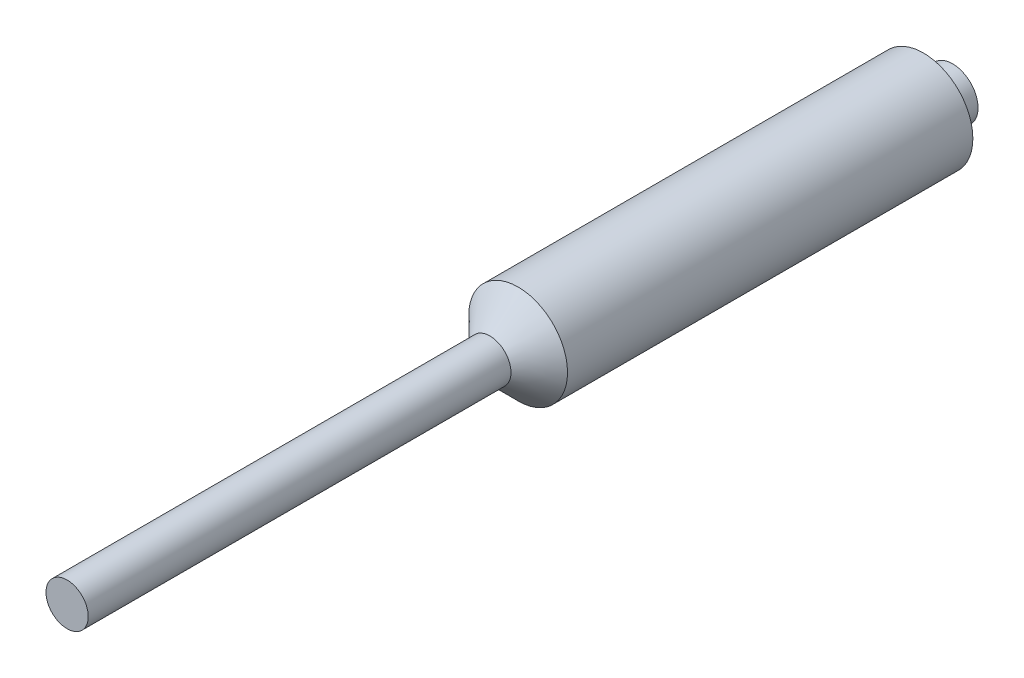
ISO-10303-21;
HEADER;
FILE_DESCRIPTION(('STEP AP214'),'2;1');
FILE_NAME('part.step','',(''),(''),'','','');
FILE_SCHEMA(('AUTOMOTIVE_DESIGN { 1 0 10303 214 1 1 1 1 }'));
ENDSEC;
DATA;
#1=APPLICATION_CONTEXT('core data for automotive mechanical design processes');
#2=APPLICATION_PROTOCOL_DEFINITION('international standard','automotive_design',2000,#1);
#3=PRODUCT_CONTEXT('',#1,'mechanical');
#4=PRODUCT('Part','Part','',(#3));
#5=PRODUCT_RELATED_PRODUCT_CATEGORY('part','',(#4));
#6=PRODUCT_DEFINITION_FORMATION('','',#4);
#7=PRODUCT_DEFINITION_CONTEXT('part definition',#1,'design');
#8=PRODUCT_DEFINITION('design','',#6,#7);
#9=PRODUCT_DEFINITION_SHAPE('','',#8);
#10=(LENGTH_UNIT() NAMED_UNIT(*) SI_UNIT(.MILLI.,.METRE.));
#11=(NAMED_UNIT(*) PLANE_ANGLE_UNIT() SI_UNIT($,.RADIAN.));
#12=(NAMED_UNIT(*) SI_UNIT($,.STERADIAN.) SOLID_ANGLE_UNIT());
#13=UNCERTAINTY_MEASURE_WITH_UNIT(LENGTH_MEASURE(1.E-05),#10,'distance_accuracy_value','');
#14=(GEOMETRIC_REPRESENTATION_CONTEXT(3) GLOBAL_UNCERTAINTY_ASSIGNED_CONTEXT((#13)) GLOBAL_UNIT_ASSIGNED_CONTEXT((#10,
#11,#12)) REPRESENTATION_CONTEXT('',''));
#15=CARTESIAN_POINT('',(0.,0.,0.));
#16=DIRECTION('',(0.,0.,1.));
#17=DIRECTION('',(1.,0.,0.));
#18=AXIS2_PLACEMENT_3D('',#15,#16,#17);
#19=CARTESIAN_POINT('',(0.,0.,49.53));
#20=DIRECTION('',(0.,0.,-1.));
#21=DIRECTION('',(-1.,0.,0.));
#22=AXIS2_PLACEMENT_3D('',#19,#20,#21);
#23=CYLINDRICAL_SURFACE('',#22,5.49275);
#24=CARTESIAN_POINT('',(0.,0.,45.085));
#25=DIRECTION('',(0.,0.,1.));
#26=DIRECTION('',(1.,0.,0.));
#27=AXIS2_PLACEMENT_3D('',#24,#25,#26);
#28=CIRCLE('',#27,5.49275);
#29=CARTESIAN_POINT('',(5.49275,0.,45.085));
#30=VERTEX_POINT('',#29);
#31=EDGE_CURVE('E46',#30,#30,#28,.F.);
#32=ORIENTED_EDGE('',*,*,#31,.T.);
#33=EDGE_LOOP('',(#32));
#34=FACE_BOUND('',#33,.T.);
#35=CARTESIAN_POINT('',(0.,0.,0.));
#36=DIRECTION('',(0.,0.,1.));
#37=DIRECTION('',(1.,0.,0.));
#38=AXIS2_PLACEMENT_3D('',#35,#36,#37);
#39=CIRCLE('',#38,5.49275);
#40=CARTESIAN_POINT('',(5.49275,0.,0.));
#41=VERTEX_POINT('',#40);
#42=EDGE_CURVE('E53',#41,#41,#39,.T.);
#43=ORIENTED_EDGE('',*,*,#42,.T.);
#44=EDGE_LOOP('',(#43));
#45=FACE_BOUND('',#44,.T.);
#46=ADVANCED_FACE('F34',(#34,#45),#23,.T.);
#47=CARTESIAN_POINT('',(0.,0.,0.));
#48=DIRECTION('',(0.,0.,1.));
#49=DIRECTION('',(1.,0.,0.));
#50=AXIS2_PLACEMENT_3D('',#47,#48,#49);
#51=PLANE('',#50);
#52=CARTESIAN_POINT('',(0.,0.,0.));
#53=DIRECTION('',(0.,0.,-1.));
#54=DIRECTION('',(-1.,0.,0.));
#55=AXIS2_PLACEMENT_3D('',#52,#53,#54);
#56=CIRCLE('',#55,2.8321);
#57=CARTESIAN_POINT('',(-2.8321,0.,0.));
#58=VERTEX_POINT('',#57);
#59=EDGE_CURVE('E10',#58,#58,#56,.T.);
#60=ORIENTED_EDGE('',*,*,#59,.F.);
#61=EDGE_LOOP('',(#60));
#62=FACE_BOUND('',#61,.T.);
#63=ORIENTED_EDGE('',*,*,#42,.F.);
#64=EDGE_LOOP('',(#63));
#65=FACE_BOUND('',#64,.T.);
#66=ADVANCED_FACE('F69',(#62,#65),#51,.F.);
#67=CARTESIAN_POINT('',(0.,0.,95.25));
#68=DIRECTION('',(0.,0.,-1.));
#69=DIRECTION('',(-1.,0.,0.));
#70=AXIS2_PLACEMENT_3D('',#67,#68,#69);
#71=CYLINDRICAL_SURFACE('',#70,2.3495);
#72=CARTESIAN_POINT('',(0.,0.,48.2282499999999));
#73=DIRECTION('',(0.,0.,-1.));
#74=DIRECTION('',(-1.,0.,0.));
#75=AXIS2_PLACEMENT_3D('',#72,#73,#74);
#76=CIRCLE('',#75,2.3495);
#77=CARTESIAN_POINT('',(-2.3495,0.,48.2282499999999));
#78=VERTEX_POINT('',#77);
#79=EDGE_CURVE('E38',#78,#78,#76,.F.);
#80=ORIENTED_EDGE('',*,*,#79,.T.);
#81=EDGE_LOOP('',(#80));
#82=FACE_BOUND('',#81,.T.);
#83=CARTESIAN_POINT('',(0.,0.,95.25));
#84=DIRECTION('',(0.,0.,1.));
#85=DIRECTION('',(1.,0.,0.));
#86=AXIS2_PLACEMENT_3D('',#83,#84,#85);
#87=CIRCLE('',#86,2.3495);
#88=CARTESIAN_POINT('',(2.3495,0.,95.25));
#89=VERTEX_POINT('',#88);
#90=EDGE_CURVE('E50',#89,#89,#87,.T.);
#91=ORIENTED_EDGE('',*,*,#90,.F.);
#92=EDGE_LOOP('',(#91));
#93=FACE_BOUND('',#92,.T.);
#94=ADVANCED_FACE('F66',(#82,#93),#71,.T.);
#95=CARTESIAN_POINT('',(0.,0.,95.25));
#96=DIRECTION('',(0.,0.,1.));
#97=DIRECTION('',(1.,0.,0.));
#98=AXIS2_PLACEMENT_3D('',#95,#96,#97);
#99=PLANE('',#98);
#100=ORIENTED_EDGE('',*,*,#90,.T.);
#101=EDGE_LOOP('',(#100));
#102=FACE_BOUND('',#101,.T.);
#103=ADVANCED_FACE('F63',(#102),#99,.T.);
#104=CARTESIAN_POINT('',(0.,0.,49.53));
#105=DIRECTION('',(0.,0.,-1.));
#106=DIRECTION('',(-1.,0.,0.));
#107=AXIS2_PLACEMENT_3D('',#104,#105,#106);
#108=CONICAL_SURFACE('',#107,1.04774999999992,0.785398163397453);
#109=ORIENTED_EDGE('',*,*,#31,.F.);
#110=EDGE_LOOP('',(#109));
#111=FACE_BOUND('',#110,.T.);
#112=ORIENTED_EDGE('',*,*,#79,.F.);
#113=EDGE_LOOP('',(#112));
#114=FACE_BOUND('',#113,.T.);
#115=ADVANCED_FACE('F36',(#111,#114),#108,.T.);
#116=CARTESIAN_POINT('',(0.,0.,-3.2385));
#117=DIRECTION('',(0.,0.,1.));
#118=DIRECTION('',(1.,0.,0.));
#119=AXIS2_PLACEMENT_3D('',#116,#117,#118);
#120=CYLINDRICAL_SURFACE('',#119,2.8321);
#121=CARTESIAN_POINT('',(0.,0.,-3.2385));
#122=DIRECTION('',(0.,0.,-1.));
#123=DIRECTION('',(-1.,0.,0.));
#124=AXIS2_PLACEMENT_3D('',#121,#122,#123);
#125=CIRCLE('',#124,2.8321);
#126=CARTESIAN_POINT('',(-2.8321,0.,-3.2385));
#127=VERTEX_POINT('',#126);
#128=EDGE_CURVE('E49',#127,#127,#125,.T.);
#129=ORIENTED_EDGE('',*,*,#128,.F.);
#130=EDGE_LOOP('',(#129));
#131=FACE_BOUND('',#130,.T.);
#132=ORIENTED_EDGE('',*,*,#59,.T.);
#133=EDGE_LOOP('',(#132));
#134=FACE_BOUND('',#133,.T.);
#135=ADVANCED_FACE('F62',(#131,#134),#120,.T.);
#136=CARTESIAN_POINT('',(0.,0.,-3.2385));
#137=DIRECTION('',(0.,0.,-1.));
#138=DIRECTION('',(-1.,0.,0.));
#139=AXIS2_PLACEMENT_3D('',#136,#137,#138);
#140=PLANE('',#139);
#141=ORIENTED_EDGE('',*,*,#128,.T.);
#142=EDGE_LOOP('',(#141));
#143=FACE_BOUND('',#142,.T.);
#144=ADVANCED_FACE('F110',(#143),#140,.T.);
#145=CLOSED_SHELL('',(#46,#66,#94,#103,#115,#135,#144));
#146=MANIFOLD_SOLID_BREP('B2',#145);
#147=ADVANCED_BREP_SHAPE_REPRESENTATION('',(#18,#146),#14);
#148=SHAPE_DEFINITION_REPRESENTATION(#9,#147);
ENDSEC;
END-ISO-10303-21;
